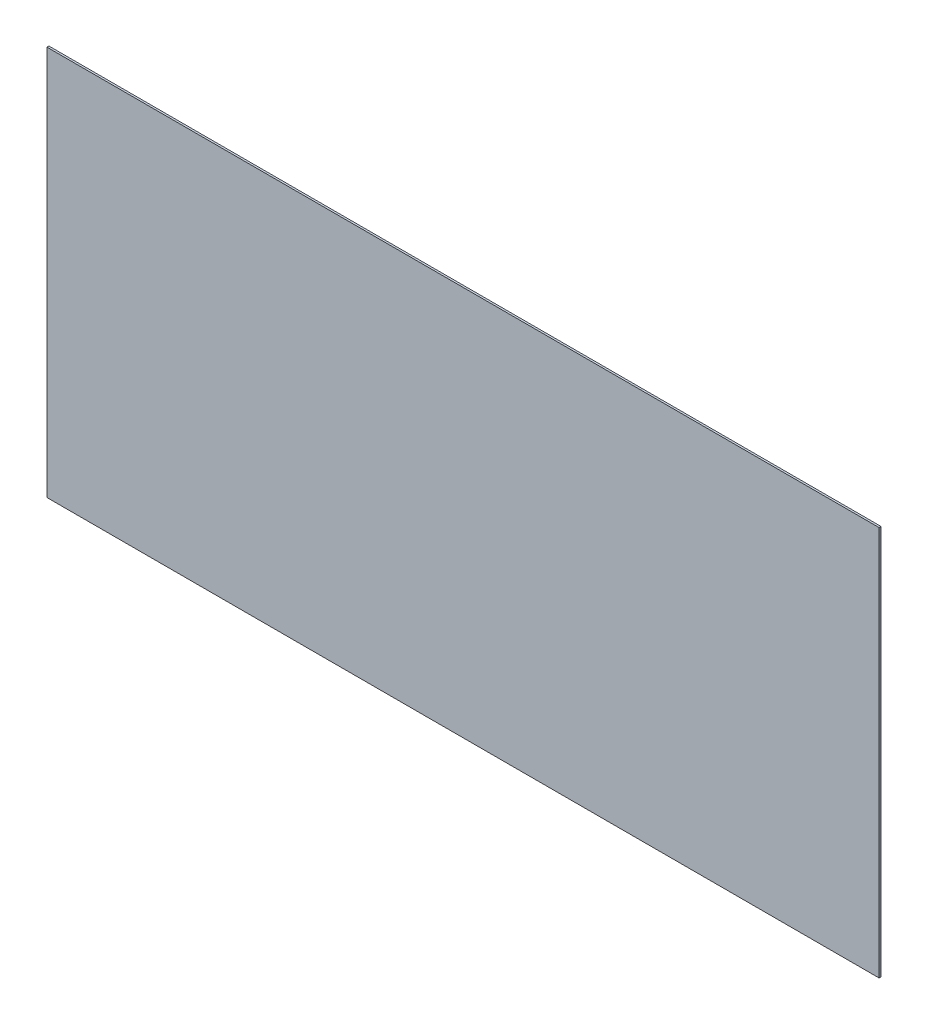
ISO-10303-21;
HEADER;
FILE_DESCRIPTION(('STEP AP214'),'2;1');
FILE_NAME('part.step','',(''),(''),'','','');
FILE_SCHEMA(('AUTOMOTIVE_DESIGN { 1 0 10303 214 1 1 1 1 }'));
ENDSEC;
DATA;
#1=APPLICATION_CONTEXT('core data for automotive mechanical design processes');
#2=APPLICATION_PROTOCOL_DEFINITION('international standard','automotive_design',2000,#1);
#3=PRODUCT_CONTEXT('',#1,'mechanical');
#4=PRODUCT('Part','Part','',(#3));
#5=PRODUCT_RELATED_PRODUCT_CATEGORY('part','',(#4));
#6=PRODUCT_DEFINITION_FORMATION('','',#4);
#7=PRODUCT_DEFINITION_CONTEXT('part definition',#1,'design');
#8=PRODUCT_DEFINITION('design','',#6,#7);
#9=PRODUCT_DEFINITION_SHAPE('','',#8);
#10=(LENGTH_UNIT() NAMED_UNIT(*) SI_UNIT(.MILLI.,.METRE.));
#11=(NAMED_UNIT(*) PLANE_ANGLE_UNIT() SI_UNIT($,.RADIAN.));
#12=(NAMED_UNIT(*) SI_UNIT($,.STERADIAN.) SOLID_ANGLE_UNIT());
#13=UNCERTAINTY_MEASURE_WITH_UNIT(LENGTH_MEASURE(1.E-05),#10,'distance_accuracy_value','');
#14=(GEOMETRIC_REPRESENTATION_CONTEXT(3) GLOBAL_UNCERTAINTY_ASSIGNED_CONTEXT((#13)) GLOBAL_UNIT_ASSIGNED_CONTEXT((#10,
#11,#12)) REPRESENTATION_CONTEXT('',''));
#15=CARTESIAN_POINT('',(0.,0.,0.));
#16=DIRECTION('',(0.,0.,1.));
#17=DIRECTION('',(1.,0.,0.));
#18=AXIS2_PLACEMENT_3D('',#15,#16,#17);
#19=CARTESIAN_POINT('',(30.,300.,40.));
#20=DIRECTION('',(1.,0.,0.));
#21=DIRECTION('',(0.,0.,-1.));
#22=AXIS2_PLACEMENT_3D('',#19,#20,#21);
#23=PLANE('',#22);
#24=DIRECTION('',(0.,-1.,0.));
#25=VECTOR('',#24,1.);
#26=CARTESIAN_POINT('',(30.,300.,38.5));
#27=LINE('',#26,#25);
#28=CARTESIAN_POINT('',(30.,600.,38.5));
#29=VERTEX_POINT('',#28);
#30=CARTESIAN_POINT('',(30.,300.,38.5));
#31=VERTEX_POINT('',#30);
#32=EDGE_CURVE('E102',#29,#31,#27,.T.);
#33=ORIENTED_EDGE('',*,*,#32,.T.);
#34=DIRECTION('',(0.,0.,-1.));
#35=VECTOR('',#34,1.);
#36=CARTESIAN_POINT('',(30.,300.,40.));
#37=LINE('',#36,#35);
#38=CARTESIAN_POINT('',(30.,300.,40.));
#39=VERTEX_POINT('',#38);
#40=EDGE_CURVE('E11',#39,#31,#37,.T.);
#41=ORIENTED_EDGE('',*,*,#40,.F.);
#42=DIRECTION('',(0.,-1.,0.));
#43=VECTOR('',#42,1.);
#44=CARTESIAN_POINT('',(30.,300.,40.));
#45=LINE('',#44,#43);
#46=CARTESIAN_POINT('',(30.,600.,40.));
#47=VERTEX_POINT('',#46);
#48=EDGE_CURVE('E90',#47,#39,#45,.T.);
#49=ORIENTED_EDGE('',*,*,#48,.F.);
#50=DIRECTION('',(0.,0.,-1.));
#51=VECTOR('',#50,1.);
#52=CARTESIAN_POINT('',(30.,600.,40.));
#53=LINE('',#52,#51);
#54=EDGE_CURVE('E98',#47,#29,#53,.T.);
#55=ORIENTED_EDGE('',*,*,#54,.T.);
#56=EDGE_LOOP('',(#33,#41,#49,#55));
#57=FACE_BOUND('',#56,.T.);
#58=ADVANCED_FACE('F39',(#57),#23,.F.);
#59=CARTESIAN_POINT('',(30.,300.,40.));
#60=DIRECTION('',(0.,1.,0.));
#61=DIRECTION('',(0.,0.,1.));
#62=AXIS2_PLACEMENT_3D('',#59,#60,#61);
#63=PLANE('',#62);
#64=DIRECTION('',(1.,0.,0.));
#65=VECTOR('',#64,1.);
#66=CARTESIAN_POINT('',(30.,300.,38.5));
#67=LINE('',#66,#65);
#68=CARTESIAN_POINT('',(670.,300.,38.5));
#69=VERTEX_POINT('',#68);
#70=EDGE_CURVE('E94',#31,#69,#67,.T.);
#71=ORIENTED_EDGE('',*,*,#70,.T.);
#72=DIRECTION('',(0.,0.,-1.));
#73=VECTOR('',#72,1.);
#74=CARTESIAN_POINT('',(670.,300.,40.));
#75=LINE('',#74,#73);
#76=CARTESIAN_POINT('',(670.,300.,40.));
#77=VERTEX_POINT('',#76);
#78=EDGE_CURVE('E47',#77,#69,#75,.T.);
#79=ORIENTED_EDGE('',*,*,#78,.F.);
#80=DIRECTION('',(1.,0.,0.));
#81=VECTOR('',#80,1.);
#82=CARTESIAN_POINT('',(30.,300.,40.));
#83=LINE('',#82,#81);
#84=EDGE_CURVE('E85',#39,#77,#83,.T.);
#85=ORIENTED_EDGE('',*,*,#84,.F.);
#86=ORIENTED_EDGE('',*,*,#40,.T.);
#87=EDGE_LOOP('',(#71,#79,#85,#86));
#88=FACE_BOUND('',#87,.T.);
#89=ADVANCED_FACE('F93',(#88),#63,.F.);
#90=CARTESIAN_POINT('',(670.,300.,40.));
#91=DIRECTION('',(-1.,0.,0.));
#92=DIRECTION('',(0.,0.,1.));
#93=AXIS2_PLACEMENT_3D('',#90,#91,#92);
#94=PLANE('',#93);
#95=DIRECTION('',(0.,1.,0.));
#96=VECTOR('',#95,1.);
#97=CARTESIAN_POINT('',(670.,300.,38.5));
#98=LINE('',#97,#96);
#99=CARTESIAN_POINT('',(670.,600.,38.5));
#100=VERTEX_POINT('',#99);
#101=EDGE_CURVE('E72',#69,#100,#98,.T.);
#102=ORIENTED_EDGE('',*,*,#101,.T.);
#103=DIRECTION('',(0.,0.,-1.));
#104=VECTOR('',#103,1.);
#105=CARTESIAN_POINT('',(670.,600.,40.));
#106=LINE('',#105,#104);
#107=CARTESIAN_POINT('',(670.,600.,40.));
#108=VERTEX_POINT('',#107);
#109=EDGE_CURVE('E95',#108,#100,#106,.T.);
#110=ORIENTED_EDGE('',*,*,#109,.F.);
#111=DIRECTION('',(0.,1.,0.));
#112=VECTOR('',#111,1.);
#113=CARTESIAN_POINT('',(670.,300.,40.));
#114=LINE('',#113,#112);
#115=EDGE_CURVE('E88',#77,#108,#114,.T.);
#116=ORIENTED_EDGE('',*,*,#115,.F.);
#117=ORIENTED_EDGE('',*,*,#78,.T.);
#118=EDGE_LOOP('',(#102,#110,#116,#117));
#119=FACE_BOUND('',#118,.T.);
#120=ADVANCED_FACE('F96',(#119),#94,.F.);
#121=CARTESIAN_POINT('',(30.,600.,40.));
#122=DIRECTION('',(0.,-1.,0.));
#123=DIRECTION('',(0.,0.,-1.));
#124=AXIS2_PLACEMENT_3D('',#121,#122,#123);
#125=PLANE('',#124);
#126=DIRECTION('',(-1.,0.,0.));
#127=VECTOR('',#126,1.);
#128=CARTESIAN_POINT('',(30.,600.,38.5));
#129=LINE('',#128,#127);
#130=EDGE_CURVE('E78',#100,#29,#129,.T.);
#131=ORIENTED_EDGE('',*,*,#130,.T.);
#132=ORIENTED_EDGE('',*,*,#54,.F.);
#133=DIRECTION('',(-1.,0.,0.));
#134=VECTOR('',#133,1.);
#135=CARTESIAN_POINT('',(30.,600.,40.));
#136=LINE('',#135,#134);
#137=EDGE_CURVE('E55',#108,#47,#136,.T.);
#138=ORIENTED_EDGE('',*,*,#137,.F.);
#139=ORIENTED_EDGE('',*,*,#109,.T.);
#140=EDGE_LOOP('',(#131,#132,#138,#139));
#141=FACE_BOUND('',#140,.T.);
#142=ADVANCED_FACE('F109',(#141),#125,.F.);
#143=CARTESIAN_POINT('',(0.,0.,40.));
#144=DIRECTION('',(0.,0.,-1.));
#145=DIRECTION('',(-1.,0.,0.));
#146=AXIS2_PLACEMENT_3D('',#143,#144,#145);
#147=PLANE('',#146);
#148=ORIENTED_EDGE('',*,*,#48,.T.);
#149=ORIENTED_EDGE('',*,*,#84,.T.);
#150=ORIENTED_EDGE('',*,*,#115,.T.);
#151=ORIENTED_EDGE('',*,*,#137,.T.);
#152=EDGE_LOOP('',(#148,#149,#150,#151));
#153=FACE_BOUND('',#152,.T.);
#154=ADVANCED_FACE('F86',(#153),#147,.F.);
#155=CARTESIAN_POINT('',(0.,0.,38.5));
#156=DIRECTION('',(0.,0.,-1.));
#157=DIRECTION('',(-1.,0.,0.));
#158=AXIS2_PLACEMENT_3D('',#155,#156,#157);
#159=PLANE('',#158);
#160=ORIENTED_EDGE('',*,*,#32,.F.);
#161=ORIENTED_EDGE('',*,*,#130,.F.);
#162=ORIENTED_EDGE('',*,*,#101,.F.);
#163=ORIENTED_EDGE('',*,*,#70,.F.);
#164=EDGE_LOOP('',(#160,#161,#162,#163));
#165=FACE_BOUND('',#164,.T.);
#166=ADVANCED_FACE('F112',(#165),#159,.T.);
#167=CLOSED_SHELL('',(#58,#89,#120,#142,#154,#166));
#168=MANIFOLD_SOLID_BREP('B2',#167);
#169=ADVANCED_BREP_SHAPE_REPRESENTATION('',(#18,#168),#14);
#170=SHAPE_DEFINITION_REPRESENTATION(#9,#169);
ENDSEC;
END-ISO-10303-21;
